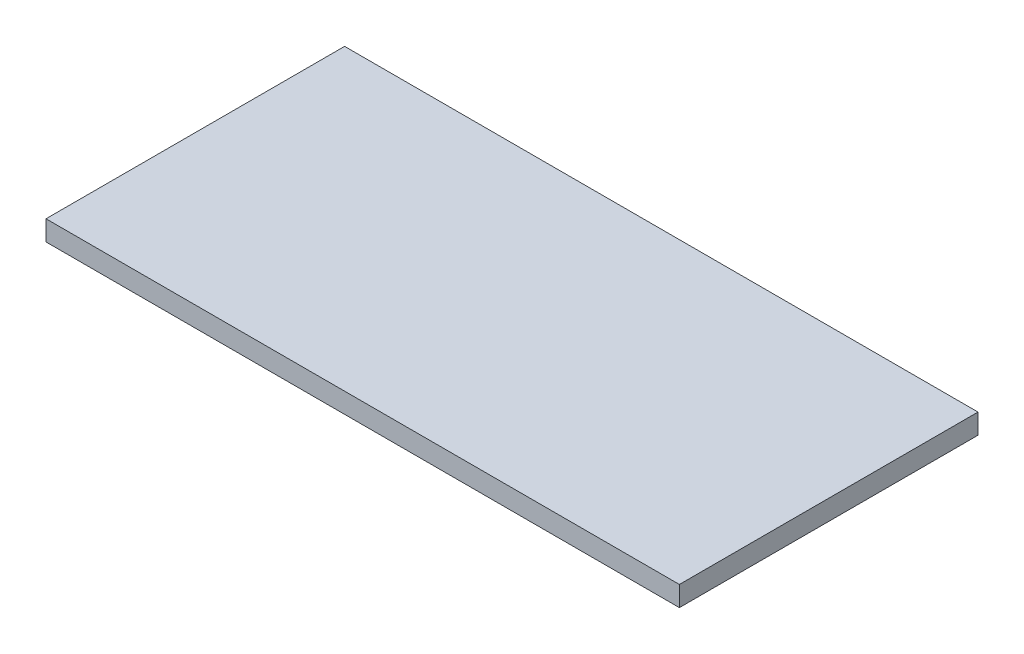
ISO-10303-21;
HEADER;
FILE_DESCRIPTION(('STEP AP214'),'2;1');
FILE_NAME('part.step','',(''),(''),'','','');
FILE_SCHEMA(('AUTOMOTIVE_DESIGN { 1 0 10303 214 1 1 1 1 }'));
ENDSEC;
DATA;
#1=APPLICATION_CONTEXT('core data for automotive mechanical design processes');
#2=APPLICATION_PROTOCOL_DEFINITION('international standard','automotive_design',2000,#1);
#3=PRODUCT_CONTEXT('',#1,'mechanical');
#4=PRODUCT('Part','Part','',(#3));
#5=PRODUCT_RELATED_PRODUCT_CATEGORY('part','',(#4));
#6=PRODUCT_DEFINITION_FORMATION('','',#4);
#7=PRODUCT_DEFINITION_CONTEXT('part definition',#1,'design');
#8=PRODUCT_DEFINITION('design','',#6,#7);
#9=PRODUCT_DEFINITION_SHAPE('','',#8);
#10=(LENGTH_UNIT() NAMED_UNIT(*) SI_UNIT(.MILLI.,.METRE.));
#11=(NAMED_UNIT(*) PLANE_ANGLE_UNIT() SI_UNIT($,.RADIAN.));
#12=(NAMED_UNIT(*) SI_UNIT($,.STERADIAN.) SOLID_ANGLE_UNIT());
#13=UNCERTAINTY_MEASURE_WITH_UNIT(LENGTH_MEASURE(1.E-05),#10,'distance_accuracy_value','');
#14=(GEOMETRIC_REPRESENTATION_CONTEXT(3) GLOBAL_UNCERTAINTY_ASSIGNED_CONTEXT((#13)) GLOBAL_UNIT_ASSIGNED_CONTEXT((#10,
#11,#12)) REPRESENTATION_CONTEXT('',''));
#15=CARTESIAN_POINT('',(0.,0.,0.));
#16=DIRECTION('',(0.,0.,1.));
#17=DIRECTION('',(1.,0.,0.));
#18=AXIS2_PLACEMENT_3D('',#15,#16,#17);
#19=CARTESIAN_POINT('',(47.3,3.,22.3));
#20=DIRECTION('',(-1.,0.,0.));
#21=DIRECTION('',(0.,0.,1.));
#22=AXIS2_PLACEMENT_3D('',#19,#20,#21);
#23=PLANE('',#22);
#24=DIRECTION('',(0.,0.,-1.));
#25=VECTOR('',#24,1.);
#26=CARTESIAN_POINT('',(47.3,0.,22.3));
#27=LINE('',#26,#25);
#28=CARTESIAN_POINT('',(47.3,0.,22.3));
#29=VERTEX_POINT('',#28);
#30=CARTESIAN_POINT('',(47.3,0.,-22.3));
#31=VERTEX_POINT('',#30);
#32=EDGE_CURVE('E96',#29,#31,#27,.T.);
#33=ORIENTED_EDGE('',*,*,#32,.T.);
#34=DIRECTION('',(0.,-1.,0.));
#35=VECTOR('',#34,1.);
#36=CARTESIAN_POINT('',(47.3,3.,-22.3));
#37=LINE('',#36,#35);
#38=CARTESIAN_POINT('',(47.3,3.,-22.3));
#39=VERTEX_POINT('',#38);
#40=EDGE_CURVE('E11',#39,#31,#37,.T.);
#41=ORIENTED_EDGE('',*,*,#40,.F.);
#42=DIRECTION('',(0.,0.,-1.));
#43=VECTOR('',#42,1.);
#44=CARTESIAN_POINT('',(47.3,3.,22.3));
#45=LINE('',#44,#43);
#46=CARTESIAN_POINT('',(47.3,3.,22.3));
#47=VERTEX_POINT('',#46);
#48=EDGE_CURVE('E84',#47,#39,#45,.T.);
#49=ORIENTED_EDGE('',*,*,#48,.F.);
#50=DIRECTION('',(0.,-1.,0.));
#51=VECTOR('',#50,1.);
#52=CARTESIAN_POINT('',(47.3,3.,22.3));
#53=LINE('',#52,#51);
#54=EDGE_CURVE('E92',#47,#29,#53,.T.);
#55=ORIENTED_EDGE('',*,*,#54,.T.);
#56=EDGE_LOOP('',(#33,#41,#49,#55));
#57=FACE_BOUND('',#56,.T.);
#58=ADVANCED_FACE('F33',(#57),#23,.F.);
#59=CARTESIAN_POINT('',(-47.3,3.,-22.3));
#60=DIRECTION('',(0.,0.,1.));
#61=DIRECTION('',(1.,0.,0.));
#62=AXIS2_PLACEMENT_3D('',#59,#60,#61);
#63=PLANE('',#62);
#64=DIRECTION('',(-1.,0.,0.));
#65=VECTOR('',#64,1.);
#66=CARTESIAN_POINT('',(-47.3,0.,-22.3));
#67=LINE('',#66,#65);
#68=CARTESIAN_POINT('',(-47.3,0.,-22.3));
#69=VERTEX_POINT('',#68);
#70=EDGE_CURVE('E88',#31,#69,#67,.T.);
#71=ORIENTED_EDGE('',*,*,#70,.T.);
#72=DIRECTION('',(0.,-1.,0.));
#73=VECTOR('',#72,1.);
#74=CARTESIAN_POINT('',(-47.3,3.,-22.3));
#75=LINE('',#74,#73);
#76=CARTESIAN_POINT('',(-47.3,3.,-22.3));
#77=VERTEX_POINT('',#76);
#78=EDGE_CURVE('E41',#77,#69,#75,.T.);
#79=ORIENTED_EDGE('',*,*,#78,.F.);
#80=DIRECTION('',(-1.,0.,0.));
#81=VECTOR('',#80,1.);
#82=CARTESIAN_POINT('',(-47.3,3.,-22.3));
#83=LINE('',#82,#81);
#84=EDGE_CURVE('E79',#39,#77,#83,.T.);
#85=ORIENTED_EDGE('',*,*,#84,.F.);
#86=ORIENTED_EDGE('',*,*,#40,.T.);
#87=EDGE_LOOP('',(#71,#79,#85,#86));
#88=FACE_BOUND('',#87,.T.);
#89=ADVANCED_FACE('F87',(#88),#63,.F.);
#90=CARTESIAN_POINT('',(-47.3,3.,22.3));
#91=DIRECTION('',(1.,0.,0.));
#92=DIRECTION('',(0.,0.,-1.));
#93=AXIS2_PLACEMENT_3D('',#90,#91,#92);
#94=PLANE('',#93);
#95=DIRECTION('',(0.,0.,1.));
#96=VECTOR('',#95,1.);
#97=CARTESIAN_POINT('',(-47.3,0.,22.3));
#98=LINE('',#97,#96);
#99=CARTESIAN_POINT('',(-47.3,0.,22.3));
#100=VERTEX_POINT('',#99);
#101=EDGE_CURVE('E66',#69,#100,#98,.T.);
#102=ORIENTED_EDGE('',*,*,#101,.T.);
#103=DIRECTION('',(0.,-1.,0.));
#104=VECTOR('',#103,1.);
#105=CARTESIAN_POINT('',(-47.3,3.,22.3));
#106=LINE('',#105,#104);
#107=CARTESIAN_POINT('',(-47.3,3.,22.3));
#108=VERTEX_POINT('',#107);
#109=EDGE_CURVE('E89',#108,#100,#106,.T.);
#110=ORIENTED_EDGE('',*,*,#109,.F.);
#111=DIRECTION('',(0.,0.,1.));
#112=VECTOR('',#111,1.);
#113=CARTESIAN_POINT('',(-47.3,3.,22.3));
#114=LINE('',#113,#112);
#115=EDGE_CURVE('E82',#77,#108,#114,.T.);
#116=ORIENTED_EDGE('',*,*,#115,.F.);
#117=ORIENTED_EDGE('',*,*,#78,.T.);
#118=EDGE_LOOP('',(#102,#110,#116,#117));
#119=FACE_BOUND('',#118,.T.);
#120=ADVANCED_FACE('F90',(#119),#94,.F.);
#121=CARTESIAN_POINT('',(-47.3,3.,22.3));
#122=DIRECTION('',(0.,0.,-1.));
#123=DIRECTION('',(-1.,0.,0.));
#124=AXIS2_PLACEMENT_3D('',#121,#122,#123);
#125=PLANE('',#124);
#126=DIRECTION('',(1.,0.,0.));
#127=VECTOR('',#126,1.);
#128=CARTESIAN_POINT('',(-47.3,0.,22.3));
#129=LINE('',#128,#127);
#130=EDGE_CURVE('E72',#100,#29,#129,.T.);
#131=ORIENTED_EDGE('',*,*,#130,.T.);
#132=ORIENTED_EDGE('',*,*,#54,.F.);
#133=DIRECTION('',(1.,0.,0.));
#134=VECTOR('',#133,1.);
#135=CARTESIAN_POINT('',(-47.3,3.,22.3));
#136=LINE('',#135,#134);
#137=EDGE_CURVE('E49',#108,#47,#136,.T.);
#138=ORIENTED_EDGE('',*,*,#137,.F.);
#139=ORIENTED_EDGE('',*,*,#109,.T.);
#140=EDGE_LOOP('',(#131,#132,#138,#139));
#141=FACE_BOUND('',#140,.T.);
#142=ADVANCED_FACE('F103',(#141),#125,.F.);
#143=CARTESIAN_POINT('',(0.,3.,0.));
#144=DIRECTION('',(0.,-1.,0.));
#145=DIRECTION('',(0.,0.,-1.));
#146=AXIS2_PLACEMENT_3D('',#143,#144,#145);
#147=PLANE('',#146);
#148=ORIENTED_EDGE('',*,*,#48,.T.);
#149=ORIENTED_EDGE('',*,*,#84,.T.);
#150=ORIENTED_EDGE('',*,*,#115,.T.);
#151=ORIENTED_EDGE('',*,*,#137,.T.);
#152=EDGE_LOOP('',(#148,#149,#150,#151));
#153=FACE_BOUND('',#152,.T.);
#154=ADVANCED_FACE('F80',(#153),#147,.F.);
#155=CARTESIAN_POINT('',(0.,0.,0.));
#156=DIRECTION('',(0.,-1.,0.));
#157=DIRECTION('',(0.,0.,-1.));
#158=AXIS2_PLACEMENT_3D('',#155,#156,#157);
#159=PLANE('',#158);
#160=ORIENTED_EDGE('',*,*,#32,.F.);
#161=ORIENTED_EDGE('',*,*,#130,.F.);
#162=ORIENTED_EDGE('',*,*,#101,.F.);
#163=ORIENTED_EDGE('',*,*,#70,.F.);
#164=EDGE_LOOP('',(#160,#161,#162,#163));
#165=FACE_BOUND('',#164,.T.);
#166=ADVANCED_FACE('F106',(#165),#159,.T.);
#167=CLOSED_SHELL('',(#58,#89,#120,#142,#154,#166));
#168=MANIFOLD_SOLID_BREP('B2',#167);
#169=ADVANCED_BREP_SHAPE_REPRESENTATION('',(#18,#168),#14);
#170=SHAPE_DEFINITION_REPRESENTATION(#9,#169);
ENDSEC;
END-ISO-10303-21;
